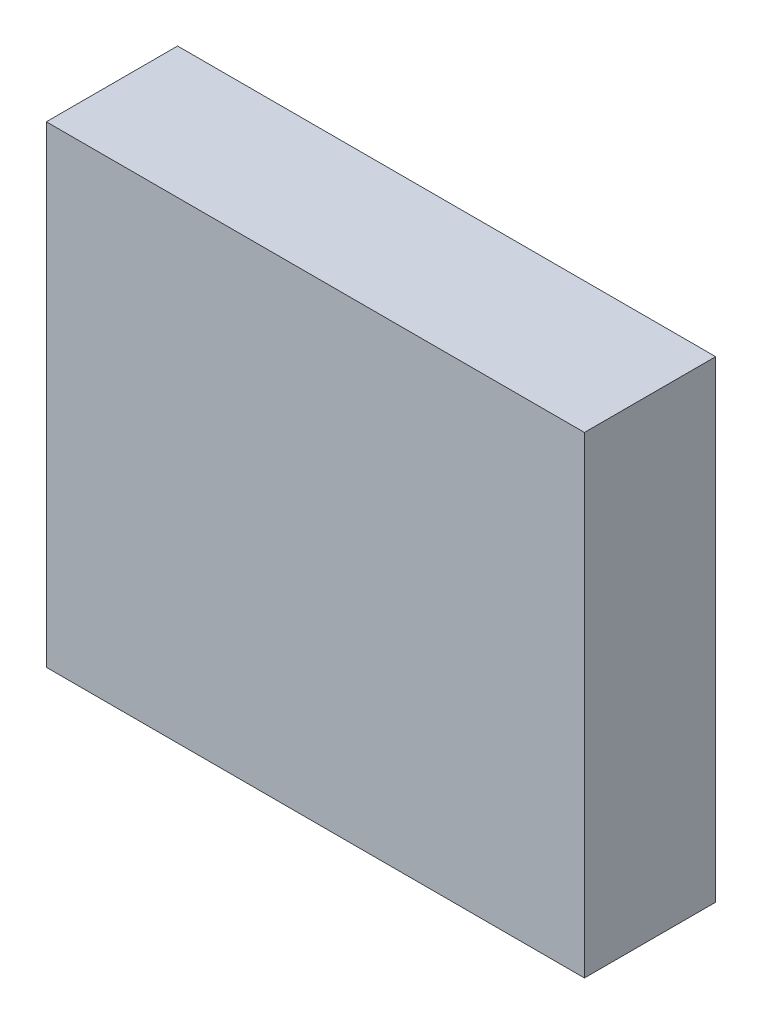
ISO-10303-21;
HEADER;
FILE_DESCRIPTION(('STEP AP214'),'2;1');
FILE_NAME('part.step','',(''),(''),'','','');
FILE_SCHEMA(('AUTOMOTIVE_DESIGN { 1 0 10303 214 1 1 1 1 }'));
ENDSEC;
DATA;
#1=APPLICATION_CONTEXT('core data for automotive mechanical design processes');
#2=APPLICATION_PROTOCOL_DEFINITION('international standard','automotive_design',2000,#1);
#3=PRODUCT_CONTEXT('',#1,'mechanical');
#4=PRODUCT('Part','Part','',(#3));
#5=PRODUCT_RELATED_PRODUCT_CATEGORY('part','',(#4));
#6=PRODUCT_DEFINITION_FORMATION('','',#4);
#7=PRODUCT_DEFINITION_CONTEXT('part definition',#1,'design');
#8=PRODUCT_DEFINITION('design','',#6,#7);
#9=PRODUCT_DEFINITION_SHAPE('','',#8);
#10=(LENGTH_UNIT() NAMED_UNIT(*) SI_UNIT(.MILLI.,.METRE.));
#11=(NAMED_UNIT(*) PLANE_ANGLE_UNIT() SI_UNIT($,.RADIAN.));
#12=(NAMED_UNIT(*) SI_UNIT($,.STERADIAN.) SOLID_ANGLE_UNIT());
#13=UNCERTAINTY_MEASURE_WITH_UNIT(LENGTH_MEASURE(1.E-05),#10,'distance_accuracy_value','');
#14=(GEOMETRIC_REPRESENTATION_CONTEXT(3) GLOBAL_UNCERTAINTY_ASSIGNED_CONTEXT((#13)) GLOBAL_UNIT_ASSIGNED_CONTEXT((#10,
#11,#12)) REPRESENTATION_CONTEXT('',''));
#15=CARTESIAN_POINT('',(0.,0.,0.));
#16=DIRECTION('',(0.,0.,1.));
#17=DIRECTION('',(1.,0.,0.));
#18=AXIS2_PLACEMENT_3D('',#15,#16,#17);
#19=CARTESIAN_POINT('',(-2.25,-1.6,1.));
#20=DIRECTION('',(1.,0.,0.));
#21=DIRECTION('',(0.,0.,-1.));
#22=AXIS2_PLACEMENT_3D('',#19,#20,#21);
#23=PLANE('',#22);
#24=DIRECTION('',(0.,-1.,0.));
#25=VECTOR('',#24,1.);
#26=CARTESIAN_POINT('',(-2.25,-1.6,0.));
#27=LINE('',#26,#25);
#28=CARTESIAN_POINT('',(-2.25,2.,0.));
#29=VERTEX_POINT('',#28);
#30=CARTESIAN_POINT('',(-2.25,-1.6,0.));
#31=VERTEX_POINT('',#30);
#32=EDGE_CURVE('E96',#29,#31,#27,.T.);
#33=ORIENTED_EDGE('',*,*,#32,.T.);
#34=DIRECTION('',(0.,0.,-1.));
#35=VECTOR('',#34,1.);
#36=CARTESIAN_POINT('',(-2.25,-1.6,1.));
#37=LINE('',#36,#35);
#38=CARTESIAN_POINT('',(-2.25,-1.6,1.));
#39=VERTEX_POINT('',#38);
#40=EDGE_CURVE('E11',#39,#31,#37,.T.);
#41=ORIENTED_EDGE('',*,*,#40,.F.);
#42=DIRECTION('',(0.,-1.,0.));
#43=VECTOR('',#42,1.);
#44=CARTESIAN_POINT('',(-2.25,-1.6,1.));
#45=LINE('',#44,#43);
#46=CARTESIAN_POINT('',(-2.25,2.,1.));
#47=VERTEX_POINT('',#46);
#48=EDGE_CURVE('E84',#47,#39,#45,.T.);
#49=ORIENTED_EDGE('',*,*,#48,.F.);
#50=DIRECTION('',(0.,0.,-1.));
#51=VECTOR('',#50,1.);
#52=CARTESIAN_POINT('',(-2.25,2.,1.));
#53=LINE('',#52,#51);
#54=EDGE_CURVE('E92',#47,#29,#53,.T.);
#55=ORIENTED_EDGE('',*,*,#54,.T.);
#56=EDGE_LOOP('',(#33,#41,#49,#55));
#57=FACE_BOUND('',#56,.T.);
#58=ADVANCED_FACE('F33',(#57),#23,.F.);
#59=CARTESIAN_POINT('',(1.85,-1.6,1.));
#60=DIRECTION('',(0.,1.,0.));
#61=DIRECTION('',(0.,0.,1.));
#62=AXIS2_PLACEMENT_3D('',#59,#60,#61);
#63=PLANE('',#62);
#64=DIRECTION('',(1.,0.,0.));
#65=VECTOR('',#64,1.);
#66=CARTESIAN_POINT('',(1.85,-1.6,0.));
#67=LINE('',#66,#65);
#68=CARTESIAN_POINT('',(1.85,-1.6,0.));
#69=VERTEX_POINT('',#68);
#70=EDGE_CURVE('E88',#31,#69,#67,.T.);
#71=ORIENTED_EDGE('',*,*,#70,.T.);
#72=DIRECTION('',(0.,0.,-1.));
#73=VECTOR('',#72,1.);
#74=CARTESIAN_POINT('',(1.85,-1.6,1.));
#75=LINE('',#74,#73);
#76=CARTESIAN_POINT('',(1.85,-1.6,1.));
#77=VERTEX_POINT('',#76);
#78=EDGE_CURVE('E41',#77,#69,#75,.T.);
#79=ORIENTED_EDGE('',*,*,#78,.F.);
#80=DIRECTION('',(1.,0.,0.));
#81=VECTOR('',#80,1.);
#82=CARTESIAN_POINT('',(1.85,-1.6,1.));
#83=LINE('',#82,#81);
#84=EDGE_CURVE('E79',#39,#77,#83,.T.);
#85=ORIENTED_EDGE('',*,*,#84,.F.);
#86=ORIENTED_EDGE('',*,*,#40,.T.);
#87=EDGE_LOOP('',(#71,#79,#85,#86));
#88=FACE_BOUND('',#87,.T.);
#89=ADVANCED_FACE('F87',(#88),#63,.F.);
#90=CARTESIAN_POINT('',(1.85,2.,1.));
#91=DIRECTION('',(-1.,0.,0.));
#92=DIRECTION('',(0.,0.,1.));
#93=AXIS2_PLACEMENT_3D('',#90,#91,#92);
#94=PLANE('',#93);
#95=DIRECTION('',(0.,1.,0.));
#96=VECTOR('',#95,1.);
#97=CARTESIAN_POINT('',(1.85,2.,0.));
#98=LINE('',#97,#96);
#99=CARTESIAN_POINT('',(1.85,2.,0.));
#100=VERTEX_POINT('',#99);
#101=EDGE_CURVE('E66',#69,#100,#98,.T.);
#102=ORIENTED_EDGE('',*,*,#101,.T.);
#103=DIRECTION('',(0.,0.,-1.));
#104=VECTOR('',#103,1.);
#105=CARTESIAN_POINT('',(1.85,2.,1.));
#106=LINE('',#105,#104);
#107=CARTESIAN_POINT('',(1.85,2.,1.));
#108=VERTEX_POINT('',#107);
#109=EDGE_CURVE('E89',#108,#100,#106,.T.);
#110=ORIENTED_EDGE('',*,*,#109,.F.);
#111=DIRECTION('',(0.,1.,0.));
#112=VECTOR('',#111,1.);
#113=CARTESIAN_POINT('',(1.85,2.,1.));
#114=LINE('',#113,#112);
#115=EDGE_CURVE('E82',#77,#108,#114,.T.);
#116=ORIENTED_EDGE('',*,*,#115,.F.);
#117=ORIENTED_EDGE('',*,*,#78,.T.);
#118=EDGE_LOOP('',(#102,#110,#116,#117));
#119=FACE_BOUND('',#118,.T.);
#120=ADVANCED_FACE('F90',(#119),#94,.F.);
#121=CARTESIAN_POINT('',(-2.25,2.,1.));
#122=DIRECTION('',(0.,-1.,0.));
#123=DIRECTION('',(0.,0.,-1.));
#124=AXIS2_PLACEMENT_3D('',#121,#122,#123);
#125=PLANE('',#124);
#126=DIRECTION('',(-1.,0.,0.));
#127=VECTOR('',#126,1.);
#128=CARTESIAN_POINT('',(-2.25,2.,0.));
#129=LINE('',#128,#127);
#130=EDGE_CURVE('E72',#100,#29,#129,.T.);
#131=ORIENTED_EDGE('',*,*,#130,.T.);
#132=ORIENTED_EDGE('',*,*,#54,.F.);
#133=DIRECTION('',(-1.,0.,0.));
#134=VECTOR('',#133,1.);
#135=CARTESIAN_POINT('',(-2.25,2.,1.));
#136=LINE('',#135,#134);
#137=EDGE_CURVE('E49',#108,#47,#136,.T.);
#138=ORIENTED_EDGE('',*,*,#137,.F.);
#139=ORIENTED_EDGE('',*,*,#109,.T.);
#140=EDGE_LOOP('',(#131,#132,#138,#139));
#141=FACE_BOUND('',#140,.T.);
#142=ADVANCED_FACE('F103',(#141),#125,.F.);
#143=CARTESIAN_POINT('',(0.,0.,1.));
#144=DIRECTION('',(0.,0.,-1.));
#145=DIRECTION('',(-1.,0.,0.));
#146=AXIS2_PLACEMENT_3D('',#143,#144,#145);
#147=PLANE('',#146);
#148=ORIENTED_EDGE('',*,*,#48,.T.);
#149=ORIENTED_EDGE('',*,*,#84,.T.);
#150=ORIENTED_EDGE('',*,*,#115,.T.);
#151=ORIENTED_EDGE('',*,*,#137,.T.);
#152=EDGE_LOOP('',(#148,#149,#150,#151));
#153=FACE_BOUND('',#152,.T.);
#154=ADVANCED_FACE('F80',(#153),#147,.F.);
#155=CARTESIAN_POINT('',(0.,0.,0.));
#156=DIRECTION('',(0.,0.,-1.));
#157=DIRECTION('',(-1.,0.,0.));
#158=AXIS2_PLACEMENT_3D('',#155,#156,#157);
#159=PLANE('',#158);
#160=ORIENTED_EDGE('',*,*,#32,.F.);
#161=ORIENTED_EDGE('',*,*,#130,.F.);
#162=ORIENTED_EDGE('',*,*,#101,.F.);
#163=ORIENTED_EDGE('',*,*,#70,.F.);
#164=EDGE_LOOP('',(#160,#161,#162,#163));
#165=FACE_BOUND('',#164,.T.);
#166=ADVANCED_FACE('F106',(#165),#159,.T.);
#167=CLOSED_SHELL('',(#58,#89,#120,#142,#154,#166));
#168=MANIFOLD_SOLID_BREP('B2',#167);
#169=ADVANCED_BREP_SHAPE_REPRESENTATION('',(#18,#168),#14);
#170=SHAPE_DEFINITION_REPRESENTATION(#9,#169);
ENDSEC;
END-ISO-10303-21;
